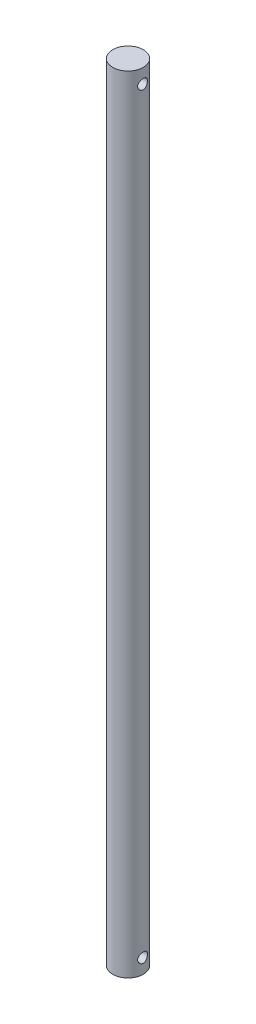
ISO-10303-21;
HEADER;
FILE_DESCRIPTION(('STEP AP214'),'2;1');
FILE_NAME('part.step','',(''),(''),'','','');
FILE_SCHEMA(('AUTOMOTIVE_DESIGN { 1 0 10303 214 1 1 1 1 }'));
ENDSEC;
DATA;
#1=APPLICATION_CONTEXT('core data for automotive mechanical design processes');
#2=APPLICATION_PROTOCOL_DEFINITION('international standard','automotive_design',2000,#1);
#3=PRODUCT_CONTEXT('',#1,'mechanical');
#4=PRODUCT('Part','Part','',(#3));
#5=PRODUCT_RELATED_PRODUCT_CATEGORY('part','',(#4));
#6=PRODUCT_DEFINITION_FORMATION('','',#4);
#7=PRODUCT_DEFINITION_CONTEXT('part definition',#1,'design');
#8=PRODUCT_DEFINITION('design','',#6,#7);
#9=PRODUCT_DEFINITION_SHAPE('','',#8);
#10=(LENGTH_UNIT() NAMED_UNIT(*) SI_UNIT(.MILLI.,.METRE.));
#11=(NAMED_UNIT(*) PLANE_ANGLE_UNIT() SI_UNIT($,.RADIAN.));
#12=(NAMED_UNIT(*) SI_UNIT($,.STERADIAN.) SOLID_ANGLE_UNIT());
#13=UNCERTAINTY_MEASURE_WITH_UNIT(LENGTH_MEASURE(1.E-05),#10,'distance_accuracy_value','');
#14=(GEOMETRIC_REPRESENTATION_CONTEXT(3) GLOBAL_UNCERTAINTY_ASSIGNED_CONTEXT((#13)) GLOBAL_UNIT_ASSIGNED_CONTEXT((#10,
#11,#12)) REPRESENTATION_CONTEXT('',''));
#15=CARTESIAN_POINT('',(0.,0.,0.));
#16=DIRECTION('',(0.,0.,1.));
#17=DIRECTION('',(1.,0.,0.));
#18=AXIS2_PLACEMENT_3D('',#15,#16,#17);
#19=CARTESIAN_POINT('',(0.,508.,0.));
#20=DIRECTION('',(0.,-1.,0.));
#21=DIRECTION('',(0.,0.,-1.));
#22=AXIS2_PLACEMENT_3D('',#19,#20,#21);
#23=CYLINDRICAL_SURFACE('',#22,9.906);
#24=CARTESIAN_POINT('',(9.38340082272947,498.602,-3.175));
#25=CARTESIAN_POINT('',(9.38340133010901,498.428648845424,-3.17499953903505));
#26=CARTESIAN_POINT('',(9.38825715963944,498.255292093388,-3.16075472323999));
#27=CARTESIAN_POINT('',(9.40706434772498,497.913687818861,-3.1043257570464));
#28=CARTESIAN_POINT('',(9.42101779273341,497.745441477662,-3.06213519751669));
#29=CARTESIAN_POINT('',(9.45628094770359,497.41905768367,-2.95142750605805));
#30=CARTESIAN_POINT('',(9.47757710955198,497.260902244538,-2.88295883397297));
#31=CARTESIAN_POINT('',(9.52510700553775,496.95827622172,-2.72180167990555));
#32=CARTESIAN_POINT('',(9.55134169611072,496.813808297031,-2.62910850505672));
#33=CARTESIAN_POINT('',(9.60685630655789,496.537435871302,-2.41854478822555));
#34=CARTESIAN_POINT('',(9.63620787712043,496.406098733426,-2.2999482742391));
#35=CARTESIAN_POINT('',(9.69404093579791,496.16479483814,-2.04249629356498));
#36=CARTESIAN_POINT('',(9.72252229521998,496.054831228824,-1.90363784777255));
#37=CARTESIAN_POINT('',(9.77622921809102,495.856865608948,-1.60549943387127));
#38=CARTESIAN_POINT('',(9.80136062407833,495.769451735603,-1.44581048456763));
#39=CARTESIAN_POINT('',(9.84469647245604,495.622946469813,-1.11305344149496));
#40=CARTESIAN_POINT('',(9.86290263233179,495.563848054089,-0.939988677802057));
#41=CARTESIAN_POINT('',(9.88982935915226,495.477556830947,-0.591336355969281));
#42=CARTESIAN_POINT('',(9.89883780880962,495.449393464855,-0.416011653478194));
#43=CARTESIAN_POINT('',(9.90737280091693,495.422692550356,-0.0629093181982171));
#44=CARTESIAN_POINT('',(9.90690160743613,495.424147927961,0.114867718751708));
#45=CARTESIAN_POINT('',(9.89672883377991,495.456013338169,0.460982753354981));
#46=CARTESIAN_POINT('',(9.88736291172926,495.485370479982,0.629429142765768));
#47=CARTESIAN_POINT('',(9.86086911434444,495.57047336135,0.958864233681692));
#48=CARTESIAN_POINT('',(9.84374072449016,495.626220850147,1.11985244005587));
#49=CARTESIAN_POINT('',(9.80320475439315,495.763174871574,1.43218240257422));
#50=CARTESIAN_POINT('',(9.77972077356479,495.844693346282,1.58337705006026));
#51=CARTESIAN_POINT('',(9.72893673648756,496.030622591593,1.87026250480182));
#52=CARTESIAN_POINT('',(9.70163567836561,496.135039376449,2.00594922462361));
#53=CARTESIAN_POINT('',(9.64470398038787,496.369169584741,2.26424039095279));
#54=CARTESIAN_POINT('',(9.61502367587065,496.499789491973,2.38601336778424));
#55=CARTESIAN_POINT('',(9.55769991346078,496.779865234723,2.60618195859899));
#56=CARTESIAN_POINT('',(9.5300567224922,496.929323531717,2.70457451277707));
#57=CARTESIAN_POINT('',(9.47967827585143,497.245289872861,2.87622483297348));
#58=CARTESIAN_POINT('',(9.45700756438128,497.411985004097,2.94915858260895));
#59=CARTESIAN_POINT('',(9.41989380059,497.756195456073,3.06565137470002));
#60=CARTESIAN_POINT('',(9.40544760898891,497.933706619679,3.1092216263025));
#61=CARTESIAN_POINT('',(9.38712048822755,498.286510345579,3.16411316255719));
#62=CARTESIAN_POINT('',(9.38282074126458,498.461582198877,3.17671375743822));
#63=CARTESIAN_POINT('',(9.38410752367471,498.811356226441,3.17291201870695));
#64=CARTESIAN_POINT('',(9.3896924268535,498.986058456783,3.15651445578878));
#65=CARTESIAN_POINT('',(9.40970418756109,499.324510097642,3.09632761940791));
#66=CARTESIAN_POINT('',(9.4238522717071,499.488431146569,3.05340110038973));
#67=CARTESIAN_POINT('',(9.45909661381936,499.806720351873,2.9423962122926));
#68=CARTESIAN_POINT('',(9.48019404316234,499.961086892535,2.87431360268498));
#69=CARTESIAN_POINT('',(9.52774108643856,500.260987774903,2.71261315798631));
#70=CARTESIAN_POINT('',(9.55433167781734,500.406120873992,2.61829369124765));
#71=CARTESIAN_POINT('',(9.60958408880189,500.678964480416,2.40760687283761));
#72=CARTESIAN_POINT('',(9.63824647277213,500.8066702129,2.29123349948747));
#73=CARTESIAN_POINT('',(9.69593652535423,501.046826024731,2.03366431016809));
#74=CARTESIAN_POINT('',(9.72492491808365,501.158359361769,1.89160256664384));
#75=CARTESIAN_POINT('',(9.77874854404601,501.356048768724,1.59007310585205));
#76=CARTESIAN_POINT('',(9.80358395359352,501.442205916104,1.43060612799758));
#77=CARTESIAN_POINT('',(9.8461700517275,501.585881003148,1.09971270486084));
#78=CARTESIAN_POINT('',(9.86397024277404,501.643599782449,0.928380168389621));
#79=CARTESIAN_POINT('',(9.89069687851541,501.729194998656,0.57776423540145));
#80=CARTESIAN_POINT('',(9.89962625951355,501.757081310562,0.398483490340096));
#81=CARTESIAN_POINT('',(9.90740032725738,501.781384680092,0.0454781964175364));
#82=CARTESIAN_POINT('',(9.90666835072807,501.779122716187,-0.128147126546096));
#83=CARTESIAN_POINT('',(9.89622665348614,501.746412425482,-0.472430473192683));
#84=CARTESIAN_POINT('',(9.88651757068729,501.715966101465,-0.643088706839324));
#85=CARTESIAN_POINT('',(9.85935481238169,501.628606592941,-0.974277122404244));
#86=CARTESIAN_POINT('',(9.84200938210128,501.57206281633,-1.13491424665937));
#87=CARTESIAN_POINT('',(9.8013609744806,501.434449997697,-1.44449364041946));
#88=CARTESIAN_POINT('',(9.77805695157489,501.353376650968,-1.59343385144341));
#89=CARTESIAN_POINT('',(9.72689320608754,501.165719324097,-1.88108625417516));
#90=CARTESIAN_POINT('',(9.69890225138927,501.058339546976,-2.01925567841204));
#91=CARTESIAN_POINT('',(9.64187566236922,500.822501940289,-2.27605033064852));
#92=CARTESIAN_POINT('',(9.61283970977304,500.694037645875,-2.39466954181592));
#93=CARTESIAN_POINT('',(9.55578495937844,500.414235401769,-2.61324313994994));
#94=CARTESIAN_POINT('',(9.52783848079125,500.262249046372,-2.71238880180853));
#95=CARTESIAN_POINT('',(9.47742003674041,499.942918613244,-2.88363592085696));
#96=CARTESIAN_POINT('',(9.45494614536394,499.775579966917,-2.95574689692775));
#97=CARTESIAN_POINT('',(9.41960211858886,499.4423403432,-3.06644435894395));
#98=CARTESIAN_POINT('',(9.40616879103593,499.277162274879,-3.10702803003376));
#99=CARTESIAN_POINT('',(9.38806912491434,498.941990354999,-3.16130230167822));
#100=CARTESIAN_POINT('',(9.38340032516461,498.771997869,-3.17500045204809));
#101=CARTESIAN_POINT('',(9.38340082272947,498.602,-3.175));
#102=B_SPLINE_CURVE_WITH_KNOTS('',3,(#24,#25,#26,#27,#28,#29,#30,#31,#32,#33,#34,#35,#36,#37,
#38,#39,#40,#41,#42,#43,#44,#45,#46,#47,#48,#49,#50,#51,#52,#53,#54,#55,#56,#57,#58,#59,#60,#61,
#62,#63,#64,#65,#66,#67,#68,#69,#70,#71,#72,#73,#74,#75,#76,#77,#78,#79,#80,#81,#82,#83,#84,#85,
#86,#87,#88,#89,#90,#91,#92,#93,#94,#95,#96,#97,#98,#99,#100,#101),.UNSPECIFIED.,.T.,.F.,(4,2,2,
2,2,2,2,2,2,2,2,2,2,2,2,2,2,2,2,2,2,2,2,2,2,2,2,2,2,2,2,2,2,2,2,2,2,2,4),(0.,0.519424913269979,
1.03896899372477,1.55755954366802,2.07625063159032,2.61195145698114,3.14773112578966,
3.69632464246908,4.24478201718658,4.77549171645943,5.30607466525916,5.81739893053467,
6.32875709290452,6.84655855087936,7.36449617288678,7.90508126396073,8.4457370627056,
8.99304239171278,9.54013867525679,10.0642241589065,10.5882234295295,11.0960183198062,
11.6038988474713,12.1269412246056,12.6501266214325,13.1962977107936,13.742445606616,
14.2846791015579,14.8267330533656,15.3451174273333,15.863464967704,16.3746903114133,
16.8860054224304,17.4152743224352,17.9447058088799,18.4928662860358,19.0408335748635,
19.550353890646,20.0597311057994),.UNSPECIFIED.);
#103=CARTESIAN_POINT('',(9.38340082272947,498.602,-3.175));
#104=VERTEX_POINT('',#103);
#105=EDGE_CURVE('E55',#104,#104,#102,.T.);
#106=ORIENTED_EDGE('',*,*,#105,.T.);
#107=EDGE_LOOP('',(#106));
#108=FACE_BOUND('',#107,.T.);
#109=CARTESIAN_POINT('',(0.,508.,0.));
#110=DIRECTION('',(0.,1.,0.));
#111=DIRECTION('',(0.,0.,1.));
#112=AXIS2_PLACEMENT_3D('',#109,#110,#111);
#113=CIRCLE('',#112,9.906);
#114=CARTESIAN_POINT('',(0.,508.,9.906));
#115=VERTEX_POINT('',#114);
#116=EDGE_CURVE('E10',#115,#115,#113,.T.);
#117=ORIENTED_EDGE('',*,*,#116,.F.);
#118=EDGE_LOOP('',(#117));
#119=FACE_BOUND('',#118,.T.);
#120=CARTESIAN_POINT('',(0.,0.,0.));
#121=DIRECTION('',(0.,1.,0.));
#122=DIRECTION('',(0.,0.,1.));
#123=AXIS2_PLACEMENT_3D('',#120,#121,#122);
#124=CIRCLE('',#123,9.906);
#125=CARTESIAN_POINT('',(0.,0.,9.906));
#126=VERTEX_POINT('',#125);
#127=EDGE_CURVE('E50',#126,#126,#124,.T.);
#128=ORIENTED_EDGE('',*,*,#127,.T.);
#129=EDGE_LOOP('',(#128));
#130=FACE_BOUND('',#129,.T.);
#131=CARTESIAN_POINT('',(9.38340082272947,9.39800000000002,-3.175));
#132=CARTESIAN_POINT('',(9.38340133010901,9.57135115457611,-3.17499953903505));
#133=CARTESIAN_POINT('',(9.38825715963944,9.74470790661233,-3.16075472323999));
#134=CARTESIAN_POINT('',(9.40706434772498,10.0863121811389,-3.10432575704639));
#135=CARTESIAN_POINT('',(9.42101779273341,10.2545585223383,-3.06213519751668));
#136=CARTESIAN_POINT('',(9.45628094770359,10.5809423163298,-2.95142750605805));
#137=CARTESIAN_POINT('',(9.47757710955198,10.7390977554621,-2.88295883397298));
#138=CARTESIAN_POINT('',(9.52510700553775,11.04172377828,-2.72180167990556));
#139=CARTESIAN_POINT('',(9.55134169611072,11.1861917029695,-2.62910850505673));
#140=CARTESIAN_POINT('',(9.60685630655789,11.4625641286984,-2.41854478822555));
#141=CARTESIAN_POINT('',(9.63620787712043,11.5939012665736,-2.29994827423911));
#142=CARTESIAN_POINT('',(9.69404093579791,11.8352051618605,-2.04249629356498));
#143=CARTESIAN_POINT('',(9.72252229521997,11.9451687711758,-1.90363784777255));
#144=CARTESIAN_POINT('',(9.77622921809102,12.1431343910523,-1.60549943387127));
#145=CARTESIAN_POINT('',(9.80136062407833,12.2305482643965,-1.44581048456764));
#146=CARTESIAN_POINT('',(9.84469647245604,12.3770535301868,-1.11305344149497));
#147=CARTESIAN_POINT('',(9.86290263233179,12.436151945911,-0.939988677802073));
#148=CARTESIAN_POINT('',(9.88982935915226,12.5224431690531,-0.591336355969294));
#149=CARTESIAN_POINT('',(9.89883780880962,12.5506065351452,-0.416011653478201));
#150=CARTESIAN_POINT('',(9.90737280091693,12.5773074496442,-0.0629093181982179));
#151=CARTESIAN_POINT('',(9.90690160743613,12.5758520720387,0.114867718751708));
#152=CARTESIAN_POINT('',(9.89672883377991,12.5439866618311,0.460982753354989));
#153=CARTESIAN_POINT('',(9.88736291172926,12.5146295200176,0.629429142765784));
#154=CARTESIAN_POINT('',(9.86086911434444,12.4295266386503,0.958864233681706));
#155=CARTESIAN_POINT('',(9.84374072449016,12.3737791498527,1.11985244005588));
#156=CARTESIAN_POINT('',(9.80320475439315,12.2368251284257,1.43218240257422));
#157=CARTESIAN_POINT('',(9.77972077356479,12.1553066537184,1.58337705006026));
#158=CARTESIAN_POINT('',(9.72893673648756,11.9693774084072,1.87026250480183));
#159=CARTESIAN_POINT('',(9.70163567836561,11.8649606235514,2.00594922462361));
#160=CARTESIAN_POINT('',(9.64470398038788,11.6308304152591,2.26424039095279));
#161=CARTESIAN_POINT('',(9.61502367587066,11.5002105080274,2.38601336778422));
#162=CARTESIAN_POINT('',(9.55769991346078,11.220134765277,2.60618195859898));
#163=CARTESIAN_POINT('',(9.5300567224922,11.0706764682835,2.70457451277707));
#164=CARTESIAN_POINT('',(9.47967827585143,10.7547101271388,2.87622483297348));
#165=CARTESIAN_POINT('',(9.45700756438128,10.588014995903,2.94915858260894));
#166=CARTESIAN_POINT('',(9.41989380059001,10.2438045439271,3.06565137470001));
#167=CARTESIAN_POINT('',(9.40544760898891,10.0662933803207,3.10922162630249));
#168=CARTESIAN_POINT('',(9.38712048822755,9.71348965442139,3.16411316255718));
#169=CARTESIAN_POINT('',(9.38282074126458,9.5384178011233,3.17671375743821));
#170=CARTESIAN_POINT('',(9.3841075236747,9.18864377355867,3.17291201870695));
#171=CARTESIAN_POINT('',(9.38969242685349,9.01394154321684,3.15651445578879));
#172=CARTESIAN_POINT('',(9.40970418756108,8.67548990235759,3.09632761940791));
#173=CARTESIAN_POINT('',(9.4238522717071,8.51156885343147,3.05340110038973));
#174=CARTESIAN_POINT('',(9.45909661381935,8.19327964812708,2.94239621229261));
#175=CARTESIAN_POINT('',(9.48019404316233,8.03891310746453,2.87431360268501));
#176=CARTESIAN_POINT('',(9.52774108643855,7.73901222509661,2.71261315798632));
#177=CARTESIAN_POINT('',(9.55433167781735,7.59387912600831,2.61829369124763));
#178=CARTESIAN_POINT('',(9.6095840888019,7.32103551958455,2.40760687283757));
#179=CARTESIAN_POINT('',(9.63824647277214,7.19332978710012,2.29123349948744));
#180=CARTESIAN_POINT('',(9.69593652535424,6.95317397526866,2.03366431016807));
#181=CARTESIAN_POINT('',(9.72492491808365,6.84164063823121,1.89160256664382));
#182=CARTESIAN_POINT('',(9.77874854404601,6.64395123127619,1.59007310585205));
#183=CARTESIAN_POINT('',(9.80358395359351,6.5577940838963,1.43060612799761));
#184=CARTESIAN_POINT('',(9.84617005172749,6.41411899685204,1.09971270486089));
#185=CARTESIAN_POINT('',(9.86397024277404,6.35640021755072,0.928380168389664));
#186=CARTESIAN_POINT('',(9.89069687851541,6.27080500134436,0.577764235401477));
#187=CARTESIAN_POINT('',(9.89962625951355,6.24291868943833,0.398483490340117));
#188=CARTESIAN_POINT('',(9.90740032725738,6.21861531990835,0.0454781964175505));
#189=CARTESIAN_POINT('',(9.90666835072807,6.22087728381355,-0.128147126546083));
#190=CARTESIAN_POINT('',(9.89622665348614,6.25358757451796,-0.472430473192681));
#191=CARTESIAN_POINT('',(9.88651757068729,6.28403389853487,-0.643088706839334));
#192=CARTESIAN_POINT('',(9.85935481238169,6.37139340705892,-0.974277122404254));
#193=CARTESIAN_POINT('',(9.84200938210128,6.42793718367035,-1.13491424665937));
#194=CARTESIAN_POINT('',(9.8013609744806,6.56555000230286,-1.44449364041946));
#195=CARTESIAN_POINT('',(9.77805695157488,6.64662334903184,-1.59343385144343));
#196=CARTESIAN_POINT('',(9.72689320608753,6.83428067590309,-1.88108625417518));
#197=CARTESIAN_POINT('',(9.69890225138927,6.94166045302403,-2.01925567841204));
#198=CARTESIAN_POINT('',(9.64187566236922,7.17749805971138,-2.27605033064852));
#199=CARTESIAN_POINT('',(9.61283970977304,7.30596235412472,-2.39466954181593));
#200=CARTESIAN_POINT('',(9.55578495937843,7.58576459823127,-2.61324313994995));
#201=CARTESIAN_POINT('',(9.52783848079125,7.73775095362812,-2.71238880180853));
#202=CARTESIAN_POINT('',(9.47742003674041,8.05708138675564,-2.88363592085697));
#203=CARTESIAN_POINT('',(9.45494614536394,8.22442003308279,-2.95574689692775));
#204=CARTESIAN_POINT('',(9.41960211858886,8.55765965679999,-3.06644435894395));
#205=CARTESIAN_POINT('',(9.40616879103593,8.72283772512118,-3.10702803003376));
#206=CARTESIAN_POINT('',(9.38806912491434,9.05800964500062,-3.16130230167821));
#207=CARTESIAN_POINT('',(9.38340032516462,9.22800213099966,-3.17500045204809));
#208=CARTESIAN_POINT('',(9.38340082272947,9.39800000000002,-3.175));
#209=B_SPLINE_CURVE_WITH_KNOTS('',3,(#131,#132,#133,#134,#135,#136,#137,#138,#139,#140,#141,
#142,#143,#144,#145,#146,#147,#148,#149,#150,#151,#152,#153,#154,#155,#156,#157,#158,#159,#160,
#161,#162,#163,#164,#165,#166,#167,#168,#169,#170,#171,#172,#173,#174,#175,#176,#177,#178,#179,
#180,#181,#182,#183,#184,#185,#186,#187,#188,#189,#190,#191,#192,#193,#194,#195,#196,#197,#198,
#199,#200,#201,#202,#203,#204,#205,#206,#207,#208),.UNSPECIFIED.,.T.,.F.,(4,2,2,2,2,2,2,2,2,2,2,
2,2,2,2,2,2,2,2,2,2,2,2,2,2,2,2,2,2,2,2,2,2,2,2,2,2,2,4),(0.,0.519424913270039,1.03896899372475,
1.557559543668,2.07625063159029,2.61195145698115,3.14773112578965,3.69632464246905,
4.24478201718655,4.77549171645942,5.30607466525916,5.81739893053467,6.32875709290452,
6.84655855087934,7.36449617288677,7.90508126396071,8.44573706270556,8.99304239171275,
9.54013867525675,10.0642241589064,10.5882234295295,11.0960183198061,11.6038988474713,
12.1269412246057,12.6501266214326,13.1962977107937,13.742445606616,14.2846791015578,
14.8267330533656,15.3451174273333,15.863464967704,16.3746903114133,16.8860054224304,
17.4152743224352,17.94470580888,18.4928662860357,19.0408335748635,19.550353890646,
20.0597311057994),.UNSPECIFIED.);
#210=CARTESIAN_POINT('',(9.38340082272947,9.39800000000002,-3.175));
#211=VERTEX_POINT('',#210);
#212=EDGE_CURVE('E42',#211,#211,#209,.T.);
#213=ORIENTED_EDGE('',*,*,#212,.F.);
#214=EDGE_LOOP('',(#213));
#215=FACE_BOUND('',#214,.T.);
#216=ADVANCED_FACE('F38',(#108,#119,#130,#215),#23,.T.);
#217=CARTESIAN_POINT('',(0.,508.,0.));
#218=DIRECTION('',(0.,1.,0.));
#219=DIRECTION('',(0.,0.,1.));
#220=AXIS2_PLACEMENT_3D('',#217,#218,#219);
#221=PLANE('',#220);
#222=ORIENTED_EDGE('',*,*,#116,.T.);
#223=EDGE_LOOP('',(#222));
#224=FACE_BOUND('',#223,.T.);
#225=ADVANCED_FACE('F73',(#224),#221,.T.);
#226=CARTESIAN_POINT('',(0.,0.,0.));
#227=DIRECTION('',(0.,1.,0.));
#228=DIRECTION('',(0.,0.,1.));
#229=AXIS2_PLACEMENT_3D('',#226,#227,#228);
#230=PLANE('',#229);
#231=ORIENTED_EDGE('',*,*,#127,.F.);
#232=EDGE_LOOP('',(#231));
#233=FACE_BOUND('',#232,.T.);
#234=ADVANCED_FACE('F71',(#233),#230,.F.);
#235=CARTESIAN_POINT('',(-2.54,498.602,0.));
#236=DIRECTION('',(1.,0.,0.));
#237=DIRECTION('',(0.,0.,-1.));
#238=AXIS2_PLACEMENT_3D('',#235,#236,#237);
#239=CYLINDRICAL_SURFACE('',#238,3.175);
#240=CARTESIAN_POINT('',(-2.54,498.602,0.));
#241=DIRECTION('',(1.,0.,0.));
#242=DIRECTION('',(0.,0.,-1.));
#243=AXIS2_PLACEMENT_3D('',#240,#241,#242);
#244=CIRCLE('',#243,3.175);
#245=CARTESIAN_POINT('',(-2.54,498.602,-3.175));
#246=VERTEX_POINT('',#245);
#247=EDGE_CURVE('E58',#246,#246,#244,.T.);
#248=ORIENTED_EDGE('',*,*,#247,.F.);
#249=EDGE_LOOP('',(#248));
#250=FACE_BOUND('',#249,.T.);
#251=ORIENTED_EDGE('',*,*,#105,.F.);
#252=EDGE_LOOP('',(#251));
#253=FACE_BOUND('',#252,.T.);
#254=ADVANCED_FACE('F65',(#250,#253),#239,.F.);
#255=CARTESIAN_POINT('',(-2.54,498.602,0.));
#256=DIRECTION('',(1.,0.,0.));
#257=DIRECTION('',(0.,0.,-1.));
#258=AXIS2_PLACEMENT_3D('',#255,#256,#257);
#259=PLANE('',#258);
#260=ORIENTED_EDGE('',*,*,#247,.T.);
#261=EDGE_LOOP('',(#260));
#262=FACE_BOUND('',#261,.T.);
#263=ADVANCED_FACE('F70',(#262),#259,.T.);
#264=CARTESIAN_POINT('',(-2.54,9.39800000000002,0.));
#265=DIRECTION('',(1.,0.,0.));
#266=DIRECTION('',(0.,0.,-1.));
#267=AXIS2_PLACEMENT_3D('',#264,#265,#266);
#268=CYLINDRICAL_SURFACE('',#267,3.175);
#269=CARTESIAN_POINT('',(-2.54,9.39800000000002,0.));
#270=DIRECTION('',(-1.,0.,0.));
#271=DIRECTION('',(0.,0.,-1.));
#272=AXIS2_PLACEMENT_3D('',#269,#270,#271);
#273=CIRCLE('',#272,3.175);
#274=CARTESIAN_POINT('',(-2.54,9.39800000000002,-3.175));
#275=VERTEX_POINT('',#274);
#276=EDGE_CURVE('E91',#275,#275,#273,.T.);
#277=ORIENTED_EDGE('',*,*,#276,.T.);
#278=EDGE_LOOP('',(#277));
#279=FACE_BOUND('',#278,.T.);
#280=ORIENTED_EDGE('',*,*,#212,.T.);
#281=EDGE_LOOP('',(#280));
#282=FACE_BOUND('',#281,.T.);
#283=ADVANCED_FACE('F96',(#279,#282),#268,.F.);
#284=CARTESIAN_POINT('',(-2.54,9.39800000000002,0.));
#285=DIRECTION('',(1.,0.,0.));
#286=DIRECTION('',(0.,0.,-1.));
#287=AXIS2_PLACEMENT_3D('',#284,#285,#286);
#288=PLANE('',#287);
#289=ORIENTED_EDGE('',*,*,#276,.F.);
#290=EDGE_LOOP('',(#289));
#291=FACE_BOUND('',#290,.T.);
#292=ADVANCED_FACE('F98',(#291),#288,.T.);
#293=CLOSED_SHELL('',(#216,#225,#234,#254,#263,#283,#292));
#294=MANIFOLD_SOLID_BREP('B2',#293);
#295=ADVANCED_BREP_SHAPE_REPRESENTATION('',(#18,#294),#14);
#296=SHAPE_DEFINITION_REPRESENTATION(#9,#295);
ENDSEC;
END-ISO-10303-21;
